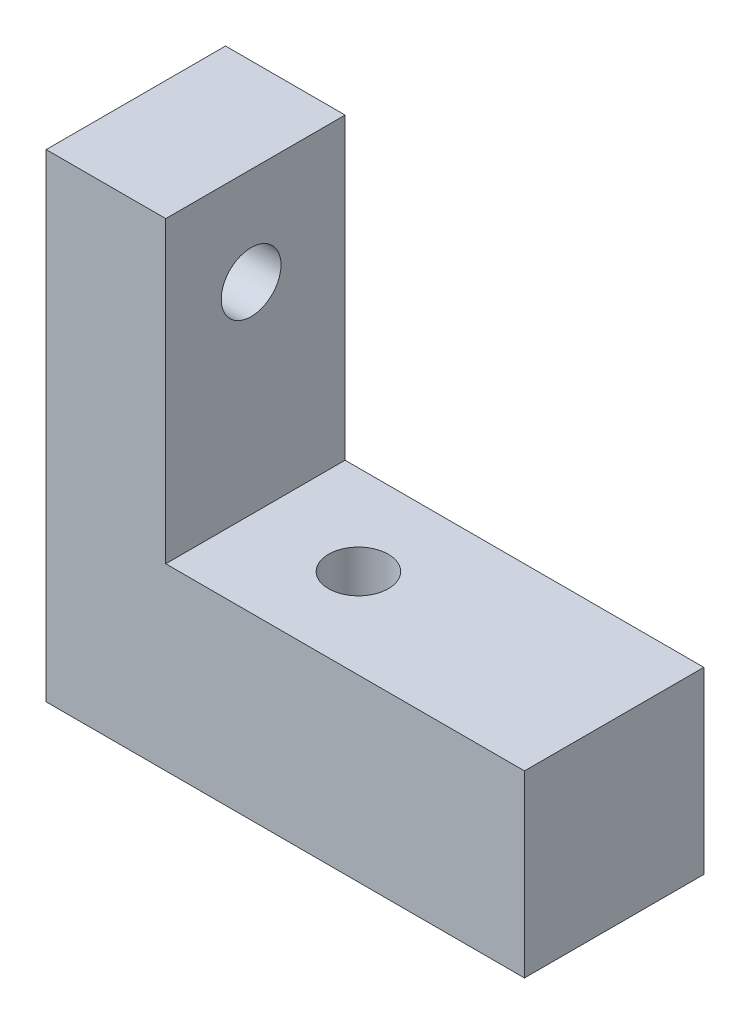
ISO-10303-21;
HEADER;
FILE_DESCRIPTION(('STEP AP214'),'2;1');
FILE_NAME('part.step','',(''),(''),'','','');
FILE_SCHEMA(('AUTOMOTIVE_DESIGN { 1 0 10303 214 1 1 1 1 }'));
ENDSEC;
DATA;
#1=APPLICATION_CONTEXT('core data for automotive mechanical design processes');
#2=APPLICATION_PROTOCOL_DEFINITION('international standard','automotive_design',2000,#1);
#3=PRODUCT_CONTEXT('',#1,'mechanical');
#4=PRODUCT('Part','Part','',(#3));
#5=PRODUCT_RELATED_PRODUCT_CATEGORY('part','',(#4));
#6=PRODUCT_DEFINITION_FORMATION('','',#4);
#7=PRODUCT_DEFINITION_CONTEXT('part definition',#1,'design');
#8=PRODUCT_DEFINITION('design','',#6,#7);
#9=PRODUCT_DEFINITION_SHAPE('','',#8);
#10=(LENGTH_UNIT() NAMED_UNIT(*) SI_UNIT(.MILLI.,.METRE.));
#11=(NAMED_UNIT(*) PLANE_ANGLE_UNIT() SI_UNIT($,.RADIAN.));
#12=(NAMED_UNIT(*) SI_UNIT($,.STERADIAN.) SOLID_ANGLE_UNIT());
#13=UNCERTAINTY_MEASURE_WITH_UNIT(LENGTH_MEASURE(1.E-05),#10,'distance_accuracy_value','');
#14=(GEOMETRIC_REPRESENTATION_CONTEXT(3) GLOBAL_UNCERTAINTY_ASSIGNED_CONTEXT((#13)) GLOBAL_UNIT_ASSIGNED_CONTEXT((#10,
#11,#12)) REPRESENTATION_CONTEXT('',''));
#15=CARTESIAN_POINT('',(0.,0.,0.));
#16=DIRECTION('',(0.,0.,1.));
#17=DIRECTION('',(1.,0.,0.));
#18=AXIS2_PLACEMENT_3D('',#15,#16,#17);
#19=CARTESIAN_POINT('',(0.,0.,30.));
#20=DIRECTION('',(0.,1.,0.));
#21=DIRECTION('',(0.,0.,1.));
#22=AXIS2_PLACEMENT_3D('',#19,#20,#21);
#23=PLANE('',#22);
#24=CARTESIAN_POINT('',(37.2284007612575,0.,15.));
#25=DIRECTION('',(0.,1.,0.));
#26=DIRECTION('',(0.,0.,1.));
#27=AXIS2_PLACEMENT_3D('',#24,#25,#26);
#28=CIRCLE('',#27,5.);
#29=CARTESIAN_POINT('',(37.2284007612575,0.,20.));
#30=VERTEX_POINT('',#29);
#31=EDGE_CURVE('E135',#30,#30,#28,.T.);
#32=ORIENTED_EDGE('',*,*,#31,.T.);
#33=EDGE_LOOP('',(#32));
#34=FACE_BOUND('',#33,.T.);
#35=DIRECTION('',(1.,0.,0.));
#36=VECTOR('',#35,1.);
#37=CARTESIAN_POINT('',(0.,0.,0.));
#38=LINE('',#37,#36);
#39=CARTESIAN_POINT('',(0.,0.,0.));
#40=VERTEX_POINT('',#39);
#41=CARTESIAN_POINT('',(80.,0.,0.));
#42=VERTEX_POINT('',#41);
#43=EDGE_CURVE('E132',#40,#42,#38,.T.);
#44=ORIENTED_EDGE('',*,*,#43,.T.);
#45=DIRECTION('',(0.,0.,-1.));
#46=VECTOR('',#45,1.);
#47=CARTESIAN_POINT('',(80.,0.,30.));
#48=LINE('',#47,#46);
#49=CARTESIAN_POINT('',(80.,0.,30.));
#50=VERTEX_POINT('',#49);
#51=EDGE_CURVE('E52',#50,#42,#48,.T.);
#52=ORIENTED_EDGE('',*,*,#51,.F.);
#53=DIRECTION('',(1.,0.,0.));
#54=VECTOR('',#53,1.);
#55=CARTESIAN_POINT('',(0.,0.,30.));
#56=LINE('',#55,#54);
#57=CARTESIAN_POINT('',(0.,0.,30.));
#58=VERTEX_POINT('',#57);
#59=EDGE_CURVE('E98',#58,#50,#56,.T.);
#60=ORIENTED_EDGE('',*,*,#59,.F.);
#61=DIRECTION('',(0.,0.,-1.));
#62=VECTOR('',#61,1.);
#63=CARTESIAN_POINT('',(0.,0.,30.));
#64=LINE('',#63,#62);
#65=EDGE_CURVE('E11',#58,#40,#64,.T.);
#66=ORIENTED_EDGE('',*,*,#65,.T.);
#67=EDGE_LOOP('',(#44,#52,#60,#66));
#68=FACE_BOUND('',#67,.T.);
#69=ADVANCED_FACE('F43',(#34,#68),#23,.F.);
#70=CARTESIAN_POINT('',(80.,0.,30.));
#71=DIRECTION('',(-1.,0.,0.));
#72=DIRECTION('',(0.,0.,1.));
#73=AXIS2_PLACEMENT_3D('',#70,#71,#72);
#74=PLANE('',#73);
#75=DIRECTION('',(0.,1.,0.));
#76=VECTOR('',#75,1.);
#77=CARTESIAN_POINT('',(80.,0.,0.));
#78=LINE('',#77,#76);
#79=CARTESIAN_POINT('',(80.,30.,0.));
#80=VERTEX_POINT('',#79);
#81=EDGE_CURVE('E134',#42,#80,#78,.T.);
#82=ORIENTED_EDGE('',*,*,#81,.T.);
#83=DIRECTION('',(0.,0.,-1.));
#84=VECTOR('',#83,1.);
#85=CARTESIAN_POINT('',(80.,30.,30.));
#86=LINE('',#85,#84);
#87=CARTESIAN_POINT('',(80.,30.,30.));
#88=VERTEX_POINT('',#87);
#89=EDGE_CURVE('E121',#88,#80,#86,.T.);
#90=ORIENTED_EDGE('',*,*,#89,.F.);
#91=DIRECTION('',(0.,1.,0.));
#92=VECTOR('',#91,1.);
#93=CARTESIAN_POINT('',(80.,0.,30.));
#94=LINE('',#93,#92);
#95=EDGE_CURVE('E112',#50,#88,#94,.T.);
#96=ORIENTED_EDGE('',*,*,#95,.F.);
#97=ORIENTED_EDGE('',*,*,#51,.T.);
#98=EDGE_LOOP('',(#82,#90,#96,#97));
#99=FACE_BOUND('',#98,.T.);
#100=ADVANCED_FACE('F148',(#99),#74,.F.);
#101=CARTESIAN_POINT('',(20.,30.,30.));
#102=DIRECTION('',(0.,-1.,0.));
#103=DIRECTION('',(0.,0.,-1.));
#104=AXIS2_PLACEMENT_3D('',#101,#102,#103);
#105=PLANE('',#104);
#106=CARTESIAN_POINT('',(37.2284007612575,30.,15.));
#107=DIRECTION('',(0.,1.,0.));
#108=DIRECTION('',(0.,0.,1.));
#109=AXIS2_PLACEMENT_3D('',#106,#107,#108);
#110=CIRCLE('',#109,5.);
#111=CARTESIAN_POINT('',(37.2284007612575,30.,20.));
#112=VERTEX_POINT('',#111);
#113=EDGE_CURVE('E158',#112,#112,#110,.T.);
#114=ORIENTED_EDGE('',*,*,#113,.F.);
#115=EDGE_LOOP('',(#114));
#116=FACE_BOUND('',#115,.T.);
#117=DIRECTION('',(-1.,0.,0.));
#118=VECTOR('',#117,1.);
#119=CARTESIAN_POINT('',(20.,30.,0.));
#120=LINE('',#119,#118);
#121=CARTESIAN_POINT('',(20.,30.,0.));
#122=VERTEX_POINT('',#121);
#123=EDGE_CURVE('E120',#80,#122,#120,.T.);
#124=ORIENTED_EDGE('',*,*,#123,.T.);
#125=DIRECTION('',(0.,0.,-1.));
#126=VECTOR('',#125,1.);
#127=CARTESIAN_POINT('',(20.,30.,30.));
#128=LINE('',#127,#126);
#129=CARTESIAN_POINT('',(20.,30.,30.));
#130=VERTEX_POINT('',#129);
#131=EDGE_CURVE('E117',#130,#122,#128,.T.);
#132=ORIENTED_EDGE('',*,*,#131,.F.);
#133=DIRECTION('',(-1.,0.,0.));
#134=VECTOR('',#133,1.);
#135=CARTESIAN_POINT('',(20.,30.,30.));
#136=LINE('',#135,#134);
#137=EDGE_CURVE('E106',#88,#130,#136,.T.);
#138=ORIENTED_EDGE('',*,*,#137,.F.);
#139=ORIENTED_EDGE('',*,*,#89,.T.);
#140=EDGE_LOOP('',(#124,#132,#138,#139));
#141=FACE_BOUND('',#140,.T.);
#142=ADVANCED_FACE('F118',(#116,#141),#105,.F.);
#143=CARTESIAN_POINT('',(20.,30.,30.));
#144=DIRECTION('',(-1.,0.,0.));
#145=DIRECTION('',(0.,0.,1.));
#146=AXIS2_PLACEMENT_3D('',#143,#144,#145);
#147=PLANE('',#146);
#148=CARTESIAN_POINT('',(20.,63.6640415542936,15.7226170012713));
#149=DIRECTION('',(1.,0.,0.));
#150=DIRECTION('',(0.,0.,-1.));
#151=AXIS2_PLACEMENT_3D('',#148,#149,#150);
#152=CIRCLE('',#151,5.);
#153=CARTESIAN_POINT('',(20.,63.6640415542936,10.7226170012713));
#154=VERTEX_POINT('',#153);
#155=EDGE_CURVE('E163',#154,#154,#152,.T.);
#156=ORIENTED_EDGE('',*,*,#155,.F.);
#157=EDGE_LOOP('',(#156));
#158=FACE_BOUND('',#157,.T.);
#159=DIRECTION('',(0.,1.,0.));
#160=VECTOR('',#159,1.);
#161=CARTESIAN_POINT('',(20.,30.,0.));
#162=LINE('',#161,#160);
#163=CARTESIAN_POINT('',(20.,80.,0.));
#164=VERTEX_POINT('',#163);
#165=EDGE_CURVE('E84',#122,#164,#162,.T.);
#166=ORIENTED_EDGE('',*,*,#165,.T.);
#167=DIRECTION('',(0.,0.,-1.));
#168=VECTOR('',#167,1.);
#169=CARTESIAN_POINT('',(20.,80.,30.));
#170=LINE('',#169,#168);
#171=CARTESIAN_POINT('',(20.,80.,30.));
#172=VERTEX_POINT('',#171);
#173=EDGE_CURVE('E122',#172,#164,#170,.T.);
#174=ORIENTED_EDGE('',*,*,#173,.F.);
#175=DIRECTION('',(0.,1.,0.));
#176=VECTOR('',#175,1.);
#177=CARTESIAN_POINT('',(20.,30.,30.));
#178=LINE('',#177,#176);
#179=EDGE_CURVE('E110',#130,#172,#178,.T.);
#180=ORIENTED_EDGE('',*,*,#179,.F.);
#181=ORIENTED_EDGE('',*,*,#131,.T.);
#182=EDGE_LOOP('',(#166,#174,#180,#181));
#183=FACE_BOUND('',#182,.T.);
#184=ADVANCED_FACE('F124',(#158,#183),#147,.F.);
#185=CARTESIAN_POINT('',(0.,80.,30.));
#186=DIRECTION('',(0.,-1.,0.));
#187=DIRECTION('',(0.,0.,-1.));
#188=AXIS2_PLACEMENT_3D('',#185,#186,#187);
#189=PLANE('',#188);
#190=DIRECTION('',(-1.,0.,0.));
#191=VECTOR('',#190,1.);
#192=CARTESIAN_POINT('',(0.,80.,0.));
#193=LINE('',#192,#191);
#194=CARTESIAN_POINT('',(0.,80.,0.));
#195=VERTEX_POINT('',#194);
#196=EDGE_CURVE('E91',#164,#195,#193,.T.);
#197=ORIENTED_EDGE('',*,*,#196,.T.);
#198=DIRECTION('',(0.,0.,-1.));
#199=VECTOR('',#198,1.);
#200=CARTESIAN_POINT('',(0.,80.,30.));
#201=LINE('',#200,#199);
#202=CARTESIAN_POINT('',(0.,80.,30.));
#203=VERTEX_POINT('',#202);
#204=EDGE_CURVE('E128',#203,#195,#201,.T.);
#205=ORIENTED_EDGE('',*,*,#204,.F.);
#206=DIRECTION('',(-1.,0.,0.));
#207=VECTOR('',#206,1.);
#208=CARTESIAN_POINT('',(0.,80.,30.));
#209=LINE('',#208,#207);
#210=EDGE_CURVE('E126',#172,#203,#209,.T.);
#211=ORIENTED_EDGE('',*,*,#210,.F.);
#212=ORIENTED_EDGE('',*,*,#173,.T.);
#213=EDGE_LOOP('',(#197,#205,#211,#212));
#214=FACE_BOUND('',#213,.T.);
#215=ADVANCED_FACE('F154',(#214),#189,.F.);
#216=CARTESIAN_POINT('',(0.,30.,30.));
#217=DIRECTION('',(1.,0.,0.));
#218=DIRECTION('',(0.,1.,0.));
#219=AXIS2_PLACEMENT_3D('',#216,#217,#218);
#220=PLANE('',#219);
#221=CARTESIAN_POINT('',(0.,63.6640415542936,15.7226170012713));
#222=DIRECTION('',(1.,0.,0.));
#223=DIRECTION('',(0.,1.,0.));
#224=AXIS2_PLACEMENT_3D('',#221,#222,#223);
#225=CIRCLE('',#224,5.);
#226=CARTESIAN_POINT('',(0.,68.6640415542936,15.7226170012713));
#227=VERTEX_POINT('',#226);
#228=EDGE_CURVE('E46',#227,#227,#225,.T.);
#229=ORIENTED_EDGE('',*,*,#228,.T.);
#230=EDGE_LOOP('',(#229));
#231=FACE_BOUND('',#230,.T.);
#232=DIRECTION('',(0.,-1.,0.));
#233=VECTOR('',#232,1.);
#234=CARTESIAN_POINT('',(0.,30.,0.));
#235=LINE('',#234,#233);
#236=EDGE_CURVE('E140',#195,#40,#235,.T.);
#237=ORIENTED_EDGE('',*,*,#236,.T.);
#238=ORIENTED_EDGE('',*,*,#65,.F.);
#239=DIRECTION('',(0.,-1.,0.));
#240=VECTOR('',#239,1.);
#241=CARTESIAN_POINT('',(0.,0.,30.));
#242=LINE('',#241,#240);
#243=EDGE_CURVE('E60',#203,#58,#242,.T.);
#244=ORIENTED_EDGE('',*,*,#243,.F.);
#245=ORIENTED_EDGE('',*,*,#204,.T.);
#246=EDGE_LOOP('',(#237,#238,#244,#245));
#247=FACE_BOUND('',#246,.T.);
#248=ADVANCED_FACE('F153',(#231,#247),#220,.F.);
#249=CARTESIAN_POINT('',(0.,0.,30.));
#250=DIRECTION('',(0.,0.,-1.));
#251=DIRECTION('',(-1.,0.,0.));
#252=AXIS2_PLACEMENT_3D('',#249,#250,#251);
#253=PLANE('',#252);
#254=ORIENTED_EDGE('',*,*,#243,.T.);
#255=ORIENTED_EDGE('',*,*,#59,.T.);
#256=ORIENTED_EDGE('',*,*,#95,.T.);
#257=ORIENTED_EDGE('',*,*,#137,.T.);
#258=ORIENTED_EDGE('',*,*,#179,.T.);
#259=ORIENTED_EDGE('',*,*,#210,.T.);
#260=EDGE_LOOP('',(#254,#255,#256,#257,#258,#259));
#261=FACE_BOUND('',#260,.T.);
#262=ADVANCED_FACE('F108',(#261),#253,.F.);
#263=CARTESIAN_POINT('',(0.,0.,0.));
#264=DIRECTION('',(0.,0.,-1.));
#265=DIRECTION('',(-1.,0.,0.));
#266=AXIS2_PLACEMENT_3D('',#263,#264,#265);
#267=PLANE('',#266);
#268=ORIENTED_EDGE('',*,*,#43,.F.);
#269=ORIENTED_EDGE('',*,*,#236,.F.);
#270=ORIENTED_EDGE('',*,*,#196,.F.);
#271=ORIENTED_EDGE('',*,*,#165,.F.);
#272=ORIENTED_EDGE('',*,*,#123,.F.);
#273=ORIENTED_EDGE('',*,*,#81,.F.);
#274=EDGE_LOOP('',(#268,#269,#270,#271,#272,#273));
#275=FACE_BOUND('',#274,.T.);
#276=ADVANCED_FACE('F151',(#275),#267,.T.);
#277=CARTESIAN_POINT('',(37.2284007612575,0.,15.));
#278=DIRECTION('',(0.,1.,0.));
#279=DIRECTION('',(0.,0.,1.));
#280=AXIS2_PLACEMENT_3D('',#277,#278,#279);
#281=CYLINDRICAL_SURFACE('',#280,5.);
#282=ORIENTED_EDGE('',*,*,#31,.F.);
#283=EDGE_LOOP('',(#282));
#284=FACE_BOUND('',#283,.T.);
#285=ORIENTED_EDGE('',*,*,#113,.T.);
#286=EDGE_LOOP('',(#285));
#287=FACE_BOUND('',#286,.T.);
#288=ADVANCED_FACE('F173',(#284,#287),#281,.F.);
#289=CARTESIAN_POINT('',(-10.,63.6640415542936,15.7226170012713));
#290=DIRECTION('',(1.,0.,0.));
#291=DIRECTION('',(0.,0.,-1.));
#292=AXIS2_PLACEMENT_3D('',#289,#290,#291);
#293=CYLINDRICAL_SURFACE('',#292,5.);
#294=ORIENTED_EDGE('',*,*,#155,.T.);
#295=EDGE_LOOP('',(#294));
#296=FACE_BOUND('',#295,.T.);
#297=ORIENTED_EDGE('',*,*,#228,.F.);
#298=EDGE_LOOP('',(#297));
#299=FACE_BOUND('',#298,.T.);
#300=ADVANCED_FACE('F171',(#296,#299),#293,.F.);
#301=CLOSED_SHELL('',(#69,#100,#142,#184,#215,#248,#262,#276,#288,#300));
#302=MANIFOLD_SOLID_BREP('B2',#301);
#303=ADVANCED_BREP_SHAPE_REPRESENTATION('',(#18,#302),#14);
#304=SHAPE_DEFINITION_REPRESENTATION(#9,#303);
ENDSEC;
END-ISO-10303-21;
